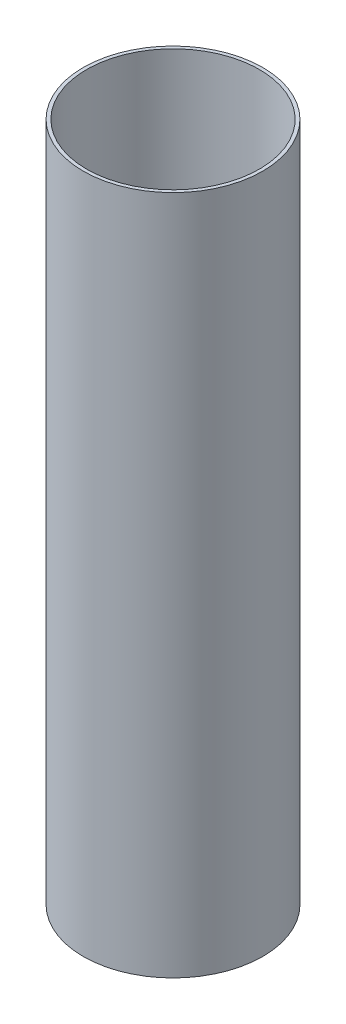
ISO-10303-21;
HEADER;
FILE_DESCRIPTION(('STEP AP214'),'2;1');
FILE_NAME('part.step','',(''),(''),'','','');
FILE_SCHEMA(('AUTOMOTIVE_DESIGN { 1 0 10303 214 1 1 1 1 }'));
ENDSEC;
DATA;
#1=APPLICATION_CONTEXT('core data for automotive mechanical design processes');
#2=APPLICATION_PROTOCOL_DEFINITION('international standard','automotive_design',2000,#1);
#3=PRODUCT_CONTEXT('',#1,'mechanical');
#4=PRODUCT('Part','Part','',(#3));
#5=PRODUCT_RELATED_PRODUCT_CATEGORY('part','',(#4));
#6=PRODUCT_DEFINITION_FORMATION('','',#4);
#7=PRODUCT_DEFINITION_CONTEXT('part definition',#1,'design');
#8=PRODUCT_DEFINITION('design','',#6,#7);
#9=PRODUCT_DEFINITION_SHAPE('','',#8);
#10=(LENGTH_UNIT() NAMED_UNIT(*) SI_UNIT(.MILLI.,.METRE.));
#11=(NAMED_UNIT(*) PLANE_ANGLE_UNIT() SI_UNIT($,.RADIAN.));
#12=(NAMED_UNIT(*) SI_UNIT($,.STERADIAN.) SOLID_ANGLE_UNIT());
#13=UNCERTAINTY_MEASURE_WITH_UNIT(LENGTH_MEASURE(1.E-05),#10,'distance_accuracy_value','');
#14=(GEOMETRIC_REPRESENTATION_CONTEXT(3) GLOBAL_UNCERTAINTY_ASSIGNED_CONTEXT((#13)) GLOBAL_UNIT_ASSIGNED_CONTEXT((#10,
#11,#12)) REPRESENTATION_CONTEXT('',''));
#15=CARTESIAN_POINT('',(0.,0.,0.));
#16=DIRECTION('',(0.,0.,1.));
#17=DIRECTION('',(1.,0.,0.));
#18=AXIS2_PLACEMENT_3D('',#15,#16,#17);
#19=CARTESIAN_POINT('',(0.,300.,0.));
#20=DIRECTION('',(0.,1.,0.));
#21=DIRECTION('',(0.,0.,1.));
#22=AXIS2_PLACEMENT_3D('',#19,#20,#21);
#23=PLANE('',#22);
#24=CARTESIAN_POINT('',(0.,300.,0.));
#25=DIRECTION('',(0.,1.,0.));
#26=DIRECTION('',(0.,0.,1.));
#27=AXIS2_PLACEMENT_3D('',#24,#25,#26);
#28=CIRCLE('',#27,39.6);
#29=CARTESIAN_POINT('',(0.,300.,39.6));
#30=VERTEX_POINT('',#29);
#31=EDGE_CURVE('E10',#30,#30,#28,.T.);
#32=ORIENTED_EDGE('',*,*,#31,.T.);
#33=EDGE_LOOP('',(#32));
#34=FACE_BOUND('',#33,.T.);
#35=CARTESIAN_POINT('',(0.,300.,0.));
#36=DIRECTION('',(0.,1.,0.));
#37=DIRECTION('',(0.,0.,1.));
#38=AXIS2_PLACEMENT_3D('',#35,#36,#37);
#39=CIRCLE('',#38,38.1);
#40=CARTESIAN_POINT('',(0.,300.,38.1));
#41=VERTEX_POINT('',#40);
#42=EDGE_CURVE('E44',#41,#41,#39,.T.);
#43=ORIENTED_EDGE('',*,*,#42,.F.);
#44=EDGE_LOOP('',(#43));
#45=FACE_BOUND('',#44,.T.);
#46=ADVANCED_FACE('F33',(#34,#45),#23,.T.);
#47=CARTESIAN_POINT('',(0.,0.,0.));
#48=DIRECTION('',(0.,1.,0.));
#49=DIRECTION('',(0.,0.,1.));
#50=AXIS2_PLACEMENT_3D('',#47,#48,#49);
#51=PLANE('',#50);
#52=CARTESIAN_POINT('',(0.,0.,0.));
#53=DIRECTION('',(0.,1.,0.));
#54=DIRECTION('',(0.,0.,1.));
#55=AXIS2_PLACEMENT_3D('',#52,#53,#54);
#56=CIRCLE('',#55,39.6);
#57=CARTESIAN_POINT('',(0.,0.,39.6));
#58=VERTEX_POINT('',#57);
#59=EDGE_CURVE('E37',#58,#58,#56,.T.);
#60=ORIENTED_EDGE('',*,*,#59,.F.);
#61=EDGE_LOOP('',(#60));
#62=FACE_BOUND('',#61,.T.);
#63=CARTESIAN_POINT('',(0.,0.,0.));
#64=DIRECTION('',(0.,1.,0.));
#65=DIRECTION('',(0.,0.,1.));
#66=AXIS2_PLACEMENT_3D('',#63,#64,#65);
#67=CIRCLE('',#66,38.1);
#68=CARTESIAN_POINT('',(0.,0.,38.1));
#69=VERTEX_POINT('',#68);
#70=EDGE_CURVE('E46',#69,#69,#67,.T.);
#71=ORIENTED_EDGE('',*,*,#70,.T.);
#72=EDGE_LOOP('',(#71));
#73=FACE_BOUND('',#72,.T.);
#74=ADVANCED_FACE('F56',(#62,#73),#51,.F.);
#75=CARTESIAN_POINT('',(0.,300.,0.));
#76=DIRECTION('',(0.,-1.,0.));
#77=DIRECTION('',(0.,0.,-1.));
#78=AXIS2_PLACEMENT_3D('',#75,#76,#77);
#79=CYLINDRICAL_SURFACE('',#78,39.6);
#80=ORIENTED_EDGE('',*,*,#31,.F.);
#81=EDGE_LOOP('',(#80));
#82=FACE_BOUND('',#81,.T.);
#83=ORIENTED_EDGE('',*,*,#59,.T.);
#84=EDGE_LOOP('',(#83));
#85=FACE_BOUND('',#84,.T.);
#86=ADVANCED_FACE('F35',(#82,#85),#79,.T.);
#87=CARTESIAN_POINT('',(0.,300.,0.));
#88=DIRECTION('',(0.,-1.,0.));
#89=DIRECTION('',(0.,0.,-1.));
#90=AXIS2_PLACEMENT_3D('',#87,#88,#89);
#91=CYLINDRICAL_SURFACE('',#90,38.1);
#92=ORIENTED_EDGE('',*,*,#42,.T.);
#93=EDGE_LOOP('',(#92));
#94=FACE_BOUND('',#93,.T.);
#95=ORIENTED_EDGE('',*,*,#70,.F.);
#96=EDGE_LOOP('',(#95));
#97=FACE_BOUND('',#96,.T.);
#98=ADVANCED_FACE('F52',(#94,#97),#91,.F.);
#99=CLOSED_SHELL('',(#46,#74,#86,#98));
#100=MANIFOLD_SOLID_BREP('B2',#99);
#101=ADVANCED_BREP_SHAPE_REPRESENTATION('',(#18,#100),#14);
#102=SHAPE_DEFINITION_REPRESENTATION(#9,#101);
ENDSEC;
END-ISO-10303-21;
